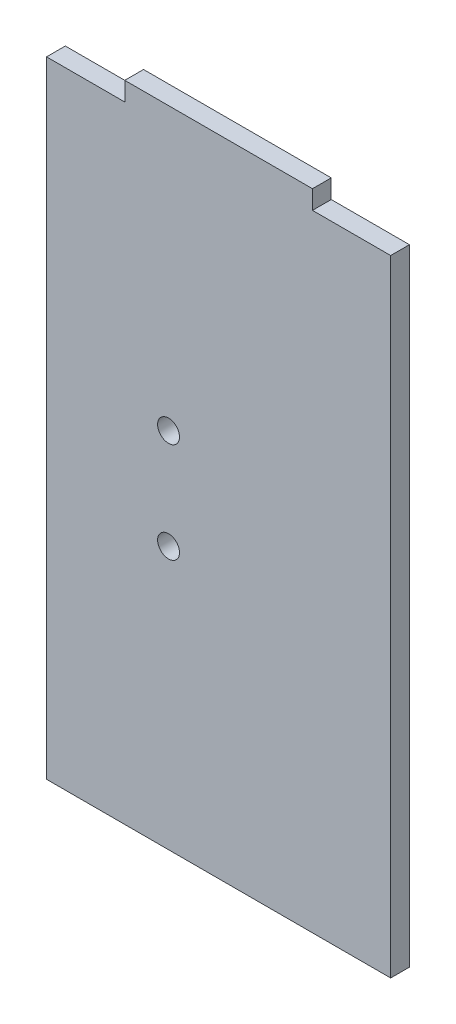
ISO-10303-21;
HEADER;
FILE_DESCRIPTION(('STEP AP214'),'2;1');
FILE_NAME('part.step','',(''),(''),'','','');
FILE_SCHEMA(('AUTOMOTIVE_DESIGN { 1 0 10303 214 1 1 1 1 }'));
ENDSEC;
DATA;
#1=APPLICATION_CONTEXT('core data for automotive mechanical design processes');
#2=APPLICATION_PROTOCOL_DEFINITION('international standard','automotive_design',2000,#1);
#3=PRODUCT_CONTEXT('',#1,'mechanical');
#4=PRODUCT('Part','Part','',(#3));
#5=PRODUCT_RELATED_PRODUCT_CATEGORY('part','',(#4));
#6=PRODUCT_DEFINITION_FORMATION('','',#4);
#7=PRODUCT_DEFINITION_CONTEXT('part definition',#1,'design');
#8=PRODUCT_DEFINITION('design','',#6,#7);
#9=PRODUCT_DEFINITION_SHAPE('','',#8);
#10=(LENGTH_UNIT() NAMED_UNIT(*) SI_UNIT(.MILLI.,.METRE.));
#11=(NAMED_UNIT(*) PLANE_ANGLE_UNIT() SI_UNIT($,.RADIAN.));
#12=(NAMED_UNIT(*) SI_UNIT($,.STERADIAN.) SOLID_ANGLE_UNIT());
#13=UNCERTAINTY_MEASURE_WITH_UNIT(LENGTH_MEASURE(1.E-05),#10,'distance_accuracy_value','');
#14=(GEOMETRIC_REPRESENTATION_CONTEXT(3) GLOBAL_UNCERTAINTY_ASSIGNED_CONTEXT((#13)) GLOBAL_UNIT_ASSIGNED_CONTEXT((#10,
#11,#12)) REPRESENTATION_CONTEXT('',''));
#15=CARTESIAN_POINT('',(0.,0.,0.));
#16=DIRECTION('',(0.,0.,1.));
#17=DIRECTION('',(1.,0.,0.));
#18=AXIS2_PLACEMENT_3D('',#15,#16,#17);
#19=CARTESIAN_POINT('',(0.,50.,3.));
#20=DIRECTION('',(0.,1.,0.));
#21=DIRECTION('',(0.,0.,1.));
#22=AXIS2_PLACEMENT_3D('',#19,#20,#21);
#23=PLANE('',#22);
#24=DIRECTION('',(1.,0.,0.));
#25=VECTOR('',#24,1.);
#26=CARTESIAN_POINT('',(0.,50.,0.));
#27=LINE('',#26,#25);
#28=CARTESIAN_POINT('',(15.,50.,0.));
#29=VERTEX_POINT('',#28);
#30=CARTESIAN_POINT('',(27.5,50.,0.));
#31=VERTEX_POINT('',#30);
#32=EDGE_CURVE('E137',#29,#31,#27,.T.);
#33=ORIENTED_EDGE('',*,*,#32,.F.);
#34=DIRECTION('',(0.,0.,-1.));
#35=VECTOR('',#34,1.);
#36=CARTESIAN_POINT('',(15.,50.,3.));
#37=LINE('',#36,#35);
#38=CARTESIAN_POINT('',(15.,50.,3.));
#39=VERTEX_POINT('',#38);
#40=EDGE_CURVE('E11',#39,#29,#37,.T.);
#41=ORIENTED_EDGE('',*,*,#40,.F.);
#42=DIRECTION('',(1.,0.,0.));
#43=VECTOR('',#42,1.);
#44=CARTESIAN_POINT('',(0.,50.,3.));
#45=LINE('',#44,#43);
#46=CARTESIAN_POINT('',(27.5,50.,3.));
#47=VERTEX_POINT('',#46);
#48=EDGE_CURVE('E132',#39,#47,#45,.T.);
#49=ORIENTED_EDGE('',*,*,#48,.T.);
#50=DIRECTION('',(0.,0.,-1.));
#51=VECTOR('',#50,1.);
#52=CARTESIAN_POINT('',(27.5,50.,3.));
#53=LINE('',#52,#51);
#54=EDGE_CURVE('E90',#47,#31,#53,.T.);
#55=ORIENTED_EDGE('',*,*,#54,.T.);
#56=EDGE_LOOP('',(#33,#41,#49,#55));
#57=FACE_BOUND('',#56,.T.);
#58=ADVANCED_FACE('F37',(#57),#23,.T.);
#59=CARTESIAN_POINT('',(15.,0.,3.));
#60=DIRECTION('',(-1.,0.,0.));
#61=DIRECTION('',(0.,0.,1.));
#62=AXIS2_PLACEMENT_3D('',#59,#60,#61);
#63=PLANE('',#62);
#64=DIRECTION('',(0.,1.,0.));
#65=VECTOR('',#64,1.);
#66=CARTESIAN_POINT('',(15.,0.,0.));
#67=LINE('',#66,#65);
#68=CARTESIAN_POINT('',(15.,53.,0.));
#69=VERTEX_POINT('',#68);
#70=EDGE_CURVE('E140',#29,#69,#67,.T.);
#71=ORIENTED_EDGE('',*,*,#70,.T.);
#72=DIRECTION('',(0.,0.,-1.));
#73=VECTOR('',#72,1.);
#74=CARTESIAN_POINT('',(15.,53.,3.));
#75=LINE('',#74,#73);
#76=CARTESIAN_POINT('',(15.,53.,3.));
#77=VERTEX_POINT('',#76);
#78=EDGE_CURVE('E47',#77,#69,#75,.T.);
#79=ORIENTED_EDGE('',*,*,#78,.F.);
#80=DIRECTION('',(0.,1.,0.));
#81=VECTOR('',#80,1.);
#82=CARTESIAN_POINT('',(15.,0.,3.));
#83=LINE('',#82,#81);
#84=EDGE_CURVE('E175',#39,#77,#83,.T.);
#85=ORIENTED_EDGE('',*,*,#84,.F.);
#86=ORIENTED_EDGE('',*,*,#40,.T.);
#87=EDGE_LOOP('',(#71,#79,#85,#86));
#88=FACE_BOUND('',#87,.T.);
#89=ADVANCED_FACE('F39',(#88),#63,.F.);
#90=CARTESIAN_POINT('',(0.,53.,3.));
#91=DIRECTION('',(0.,1.,0.));
#92=DIRECTION('',(0.,0.,1.));
#93=AXIS2_PLACEMENT_3D('',#90,#91,#92);
#94=PLANE('',#93);
#95=DIRECTION('',(1.,0.,0.));
#96=VECTOR('',#95,1.);
#97=CARTESIAN_POINT('',(0.,53.,0.));
#98=LINE('',#97,#96);
#99=CARTESIAN_POINT('',(-15.,53.,0.));
#100=VERTEX_POINT('',#99);
#101=EDGE_CURVE('E144',#100,#69,#98,.T.);
#102=ORIENTED_EDGE('',*,*,#101,.F.);
#103=DIRECTION('',(0.,0.,-1.));
#104=VECTOR('',#103,1.);
#105=CARTESIAN_POINT('',(-15.,53.,3.));
#106=LINE('',#105,#104);
#107=CARTESIAN_POINT('',(-15.,53.,3.));
#108=VERTEX_POINT('',#107);
#109=EDGE_CURVE('E159',#108,#100,#106,.T.);
#110=ORIENTED_EDGE('',*,*,#109,.F.);
#111=DIRECTION('',(1.,0.,0.));
#112=VECTOR('',#111,1.);
#113=CARTESIAN_POINT('',(0.,53.,3.));
#114=LINE('',#113,#112);
#115=EDGE_CURVE('E176',#108,#77,#114,.T.);
#116=ORIENTED_EDGE('',*,*,#115,.T.);
#117=ORIENTED_EDGE('',*,*,#78,.T.);
#118=EDGE_LOOP('',(#102,#110,#116,#117));
#119=FACE_BOUND('',#118,.T.);
#120=ADVANCED_FACE('F197',(#119),#94,.T.);
#121=CARTESIAN_POINT('',(-15.,0.,3.));
#122=DIRECTION('',(-1.,0.,0.));
#123=DIRECTION('',(0.,0.,1.));
#124=AXIS2_PLACEMENT_3D('',#121,#122,#123);
#125=PLANE('',#124);
#126=DIRECTION('',(0.,1.,0.));
#127=VECTOR('',#126,1.);
#128=CARTESIAN_POINT('',(-15.,0.,0.));
#129=LINE('',#128,#127);
#130=CARTESIAN_POINT('',(-15.,50.,0.));
#131=VERTEX_POINT('',#130);
#132=EDGE_CURVE('E147',#131,#100,#129,.T.);
#133=ORIENTED_EDGE('',*,*,#132,.F.);
#134=DIRECTION('',(0.,0.,-1.));
#135=VECTOR('',#134,1.);
#136=CARTESIAN_POINT('',(-15.,50.,3.));
#137=LINE('',#136,#135);
#138=CARTESIAN_POINT('',(-15.,50.,3.));
#139=VERTEX_POINT('',#138);
#140=EDGE_CURVE('E157',#139,#131,#137,.T.);
#141=ORIENTED_EDGE('',*,*,#140,.F.);
#142=DIRECTION('',(0.,1.,0.));
#143=VECTOR('',#142,1.);
#144=CARTESIAN_POINT('',(-15.,0.,3.));
#145=LINE('',#144,#143);
#146=EDGE_CURVE('E130',#139,#108,#145,.T.);
#147=ORIENTED_EDGE('',*,*,#146,.T.);
#148=ORIENTED_EDGE('',*,*,#109,.T.);
#149=EDGE_LOOP('',(#133,#141,#147,#148));
#150=FACE_BOUND('',#149,.T.);
#151=ADVANCED_FACE('F183',(#150),#125,.T.);
#152=CARTESIAN_POINT('',(-27.5,50.,0.));
#153=VERTEX_POINT('',#152);
#154=EDGE_CURVE('E141',#153,#131,#27,.T.);
#155=ORIENTED_EDGE('',*,*,#154,.F.);
#156=DIRECTION('',(0.,0.,-1.));
#157=VECTOR('',#156,1.);
#158=CARTESIAN_POINT('',(-27.5,50.,3.));
#159=LINE('',#158,#157);
#160=CARTESIAN_POINT('',(-27.5,50.,3.));
#161=VERTEX_POINT('',#160);
#162=EDGE_CURVE('E118',#161,#153,#159,.T.);
#163=ORIENTED_EDGE('',*,*,#162,.F.);
#164=EDGE_CURVE('E128',#161,#139,#45,.T.);
#165=ORIENTED_EDGE('',*,*,#164,.T.);
#166=ORIENTED_EDGE('',*,*,#140,.T.);
#167=EDGE_LOOP('',(#155,#163,#165,#166));
#168=FACE_BOUND('',#167,.T.);
#169=ADVANCED_FACE('F187',(#168),#23,.T.);
#170=CARTESIAN_POINT('',(-27.5,0.,3.));
#171=DIRECTION('',(-1.,0.,0.));
#172=DIRECTION('',(0.,-1.,0.));
#173=AXIS2_PLACEMENT_3D('',#170,#171,#172);
#174=PLANE('',#173);
#175=DIRECTION('',(0.,1.,0.));
#176=VECTOR('',#175,1.);
#177=CARTESIAN_POINT('',(-27.5,0.,0.));
#178=LINE('',#177,#176);
#179=CARTESIAN_POINT('',(-27.5,-50.,0.));
#180=VERTEX_POINT('',#179);
#181=EDGE_CURVE('E117',#180,#153,#178,.T.);
#182=ORIENTED_EDGE('',*,*,#181,.F.);
#183=DIRECTION('',(0.,0.,-1.));
#184=VECTOR('',#183,1.);
#185=CARTESIAN_POINT('',(-27.5,-50.,3.));
#186=LINE('',#185,#184);
#187=CARTESIAN_POINT('',(-27.5,-50.,3.));
#188=VERTEX_POINT('',#187);
#189=EDGE_CURVE('E111',#188,#180,#186,.T.);
#190=ORIENTED_EDGE('',*,*,#189,.F.);
#191=DIRECTION('',(0.,1.,0.));
#192=VECTOR('',#191,1.);
#193=CARTESIAN_POINT('',(-27.5,0.,3.));
#194=LINE('',#193,#192);
#195=EDGE_CURVE('E115',#188,#161,#194,.T.);
#196=ORIENTED_EDGE('',*,*,#195,.T.);
#197=ORIENTED_EDGE('',*,*,#162,.T.);
#198=EDGE_LOOP('',(#182,#190,#196,#197));
#199=FACE_BOUND('',#198,.T.);
#200=ADVANCED_FACE('F113',(#199),#174,.T.);
#201=CARTESIAN_POINT('',(0.,-50.,3.));
#202=DIRECTION('',(0.,1.,0.));
#203=DIRECTION('',(0.,0.,1.));
#204=AXIS2_PLACEMENT_3D('',#201,#202,#203);
#205=PLANE('',#204);
#206=DIRECTION('',(1.,0.,0.));
#207=VECTOR('',#206,1.);
#208=CARTESIAN_POINT('',(0.,-50.,0.));
#209=LINE('',#208,#207);
#210=CARTESIAN_POINT('',(27.5,-50.,0.));
#211=VERTEX_POINT('',#210);
#212=EDGE_CURVE('E83',#180,#211,#209,.T.);
#213=ORIENTED_EDGE('',*,*,#212,.T.);
#214=DIRECTION('',(0.,0.,-1.));
#215=VECTOR('',#214,1.);
#216=CARTESIAN_POINT('',(27.5,-50.,3.));
#217=LINE('',#216,#215);
#218=CARTESIAN_POINT('',(27.5,-50.,3.));
#219=VERTEX_POINT('',#218);
#220=EDGE_CURVE('E119',#219,#211,#217,.T.);
#221=ORIENTED_EDGE('',*,*,#220,.F.);
#222=DIRECTION('',(1.,0.,0.));
#223=VECTOR('',#222,1.);
#224=CARTESIAN_POINT('',(0.,-50.,3.));
#225=LINE('',#224,#223);
#226=EDGE_CURVE('E121',#188,#219,#225,.T.);
#227=ORIENTED_EDGE('',*,*,#226,.F.);
#228=ORIENTED_EDGE('',*,*,#189,.T.);
#229=EDGE_LOOP('',(#213,#221,#227,#228));
#230=FACE_BOUND('',#229,.T.);
#231=ADVANCED_FACE('F122',(#230),#205,.F.);
#232=CARTESIAN_POINT('',(27.5,0.,3.));
#233=DIRECTION('',(-1.,0.,0.));
#234=DIRECTION('',(0.,-1.,0.));
#235=AXIS2_PLACEMENT_3D('',#232,#233,#234);
#236=PLANE('',#235);
#237=DIRECTION('',(0.,1.,0.));
#238=VECTOR('',#237,1.);
#239=CARTESIAN_POINT('',(27.5,0.,0.));
#240=LINE('',#239,#238);
#241=EDGE_CURVE('E152',#211,#31,#240,.T.);
#242=ORIENTED_EDGE('',*,*,#241,.T.);
#243=ORIENTED_EDGE('',*,*,#54,.F.);
#244=DIRECTION('',(0.,1.,0.));
#245=VECTOR('',#244,1.);
#246=CARTESIAN_POINT('',(27.5,0.,3.));
#247=LINE('',#246,#245);
#248=EDGE_CURVE('E56',#219,#47,#247,.T.);
#249=ORIENTED_EDGE('',*,*,#248,.F.);
#250=ORIENTED_EDGE('',*,*,#220,.T.);
#251=EDGE_LOOP('',(#242,#243,#249,#250));
#252=FACE_BOUND('',#251,.T.);
#253=ADVANCED_FACE('F194',(#252),#236,.F.);
#254=CARTESIAN_POINT('',(0.,0.,3.));
#255=DIRECTION('',(0.,0.,1.));
#256=DIRECTION('',(1.,0.,0.));
#257=AXIS2_PLACEMENT_3D('',#254,#255,#256);
#258=PLANE('',#257);
#259=CARTESIAN_POINT('',(-8.,8.,3.));
#260=DIRECTION('',(0.,0.,1.));
#261=DIRECTION('',(1.,0.,0.));
#262=AXIS2_PLACEMENT_3D('',#259,#260,#261);
#263=CIRCLE('',#262,1.75);
#264=CARTESIAN_POINT('',(-6.25,8.,3.));
#265=VERTEX_POINT('',#264);
#266=EDGE_CURVE('E163',#265,#265,#263,.T.);
#267=ORIENTED_EDGE('',*,*,#266,.F.);
#268=EDGE_LOOP('',(#267));
#269=FACE_BOUND('',#268,.T.);
#270=CARTESIAN_POINT('',(-8.,-8.,3.));
#271=DIRECTION('',(0.,0.,1.));
#272=DIRECTION('',(-1.,0.,0.));
#273=AXIS2_PLACEMENT_3D('',#270,#271,#272);
#274=CIRCLE('',#273,1.75);
#275=CARTESIAN_POINT('',(-9.75,-8.,3.));
#276=VERTEX_POINT('',#275);
#277=EDGE_CURVE('E168',#276,#276,#274,.T.);
#278=ORIENTED_EDGE('',*,*,#277,.F.);
#279=EDGE_LOOP('',(#278));
#280=FACE_BOUND('',#279,.T.);
#281=ORIENTED_EDGE('',*,*,#48,.F.);
#282=ORIENTED_EDGE('',*,*,#84,.T.);
#283=ORIENTED_EDGE('',*,*,#115,.F.);
#284=ORIENTED_EDGE('',*,*,#146,.F.);
#285=ORIENTED_EDGE('',*,*,#164,.F.);
#286=ORIENTED_EDGE('',*,*,#195,.F.);
#287=ORIENTED_EDGE('',*,*,#226,.T.);
#288=ORIENTED_EDGE('',*,*,#248,.T.);
#289=EDGE_LOOP('',(#281,#282,#283,#284,#285,#286,#287,#288));
#290=FACE_BOUND('',#289,.T.);
#291=ADVANCED_FACE('F125',(#269,#280,#290),#258,.T.);
#292=CARTESIAN_POINT('',(0.,0.,0.));
#293=DIRECTION('',(0.,0.,1.));
#294=DIRECTION('',(1.,0.,0.));
#295=AXIS2_PLACEMENT_3D('',#292,#293,#294);
#296=PLANE('',#295);
#297=CARTESIAN_POINT('',(-8.,8.,0.));
#298=DIRECTION('',(0.,0.,1.));
#299=DIRECTION('',(1.,0.,0.));
#300=AXIS2_PLACEMENT_3D('',#297,#298,#299);
#301=CIRCLE('',#300,1.75);
#302=CARTESIAN_POINT('',(-6.25,8.,0.));
#303=VERTEX_POINT('',#302);
#304=EDGE_CURVE('E41',#303,#303,#301,.T.);
#305=ORIENTED_EDGE('',*,*,#304,.T.);
#306=EDGE_LOOP('',(#305));
#307=FACE_BOUND('',#306,.T.);
#308=CARTESIAN_POINT('',(-8.,-8.,0.));
#309=DIRECTION('',(0.,0.,1.));
#310=DIRECTION('',(1.,0.,0.));
#311=AXIS2_PLACEMENT_3D('',#308,#309,#310);
#312=CIRCLE('',#311,1.75);
#313=CARTESIAN_POINT('',(-6.25,-8.,0.));
#314=VERTEX_POINT('',#313);
#315=EDGE_CURVE('E161',#314,#314,#312,.T.);
#316=ORIENTED_EDGE('',*,*,#315,.T.);
#317=EDGE_LOOP('',(#316));
#318=FACE_BOUND('',#317,.T.);
#319=ORIENTED_EDGE('',*,*,#32,.T.);
#320=ORIENTED_EDGE('',*,*,#241,.F.);
#321=ORIENTED_EDGE('',*,*,#212,.F.);
#322=ORIENTED_EDGE('',*,*,#181,.T.);
#323=ORIENTED_EDGE('',*,*,#154,.T.);
#324=ORIENTED_EDGE('',*,*,#132,.T.);
#325=ORIENTED_EDGE('',*,*,#101,.T.);
#326=ORIENTED_EDGE('',*,*,#70,.F.);
#327=EDGE_LOOP('',(#319,#320,#321,#322,#323,#324,#325,#326));
#328=FACE_BOUND('',#327,.T.);
#329=ADVANCED_FACE('F190',(#307,#318,#328),#296,.F.);
#330=CARTESIAN_POINT('',(-8.,-8.,-7.));
#331=DIRECTION('',(0.,0.,1.));
#332=DIRECTION('',(1.,0.,0.));
#333=AXIS2_PLACEMENT_3D('',#330,#331,#332);
#334=CYLINDRICAL_SURFACE('',#333,1.75);
#335=ORIENTED_EDGE('',*,*,#277,.T.);
#336=EDGE_LOOP('',(#335));
#337=FACE_BOUND('',#336,.T.);
#338=ORIENTED_EDGE('',*,*,#315,.F.);
#339=EDGE_LOOP('',(#338));
#340=FACE_BOUND('',#339,.T.);
#341=ADVANCED_FACE('F222',(#337,#340),#334,.F.);
#342=CARTESIAN_POINT('',(-8.,8.,-7.));
#343=DIRECTION('',(0.,0.,1.));
#344=DIRECTION('',(1.,0.,0.));
#345=AXIS2_PLACEMENT_3D('',#342,#343,#344);
#346=CYLINDRICAL_SURFACE('',#345,1.75);
#347=ORIENTED_EDGE('',*,*,#266,.T.);
#348=EDGE_LOOP('',(#347));
#349=FACE_BOUND('',#348,.T.);
#350=ORIENTED_EDGE('',*,*,#304,.F.);
#351=EDGE_LOOP('',(#350));
#352=FACE_BOUND('',#351,.T.);
#353=ADVANCED_FACE('F229',(#349,#352),#346,.F.);
#354=CLOSED_SHELL('',(#58,#89,#120,#151,#169,#200,#231,#253,#291,#329,#341,#353));
#355=MANIFOLD_SOLID_BREP('B2',#354);
#356=ADVANCED_BREP_SHAPE_REPRESENTATION('',(#18,#355),#14);
#357=SHAPE_DEFINITION_REPRESENTATION(#9,#356);
ENDSEC;
END-ISO-10303-21;
